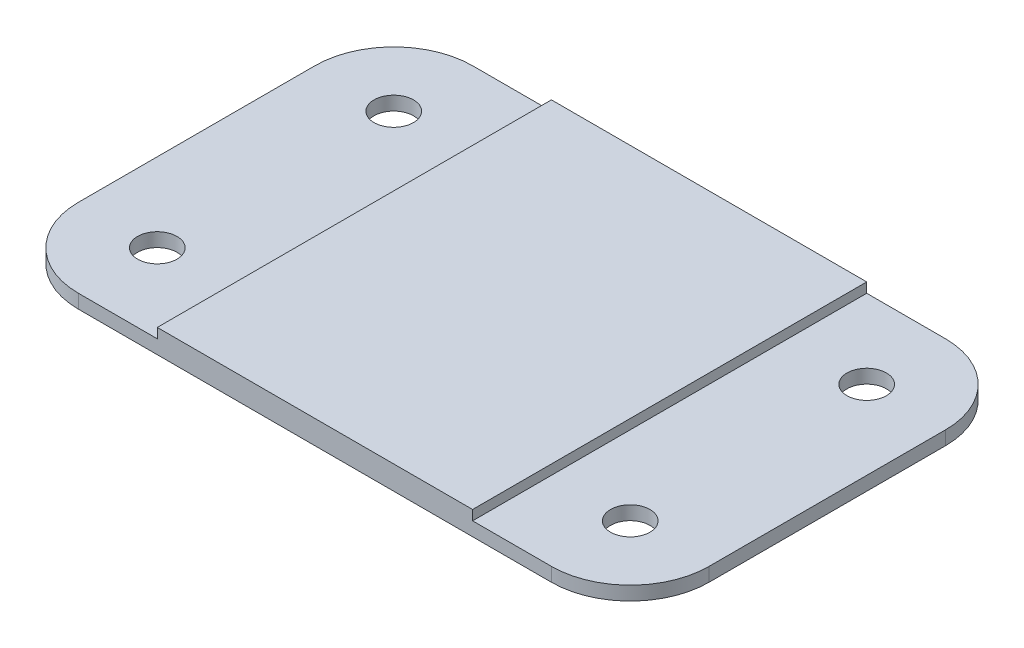
ISO-10303-21;
HEADER;
FILE_DESCRIPTION(('STEP AP214'),'2;1');
FILE_NAME('part.step','',(''),(''),'','','');
FILE_SCHEMA(('AUTOMOTIVE_DESIGN { 1 0 10303 214 1 1 1 1 }'));
ENDSEC;
DATA;
#1=APPLICATION_CONTEXT('core data for automotive mechanical design processes');
#2=APPLICATION_PROTOCOL_DEFINITION('international standard','automotive_design',2000,#1);
#3=PRODUCT_CONTEXT('',#1,'mechanical');
#4=PRODUCT('Part','Part','',(#3));
#5=PRODUCT_RELATED_PRODUCT_CATEGORY('part','',(#4));
#6=PRODUCT_DEFINITION_FORMATION('','',#4);
#7=PRODUCT_DEFINITION_CONTEXT('part definition',#1,'design');
#8=PRODUCT_DEFINITION('design','',#6,#7);
#9=PRODUCT_DEFINITION_SHAPE('','',#8);
#10=(LENGTH_UNIT() NAMED_UNIT(*) SI_UNIT(.MILLI.,.METRE.));
#11=(NAMED_UNIT(*) PLANE_ANGLE_UNIT() SI_UNIT($,.RADIAN.));
#12=(NAMED_UNIT(*) SI_UNIT($,.STERADIAN.) SOLID_ANGLE_UNIT());
#13=UNCERTAINTY_MEASURE_WITH_UNIT(LENGTH_MEASURE(1.E-05),#10,'distance_accuracy_value','');
#14=(GEOMETRIC_REPRESENTATION_CONTEXT(3) GLOBAL_UNCERTAINTY_ASSIGNED_CONTEXT((#13)) GLOBAL_UNIT_ASSIGNED_CONTEXT((#10,
#11,#12)) REPRESENTATION_CONTEXT('',''));
#15=CARTESIAN_POINT('',(0.,0.,0.));
#16=DIRECTION('',(0.,0.,1.));
#17=DIRECTION('',(1.,0.,0.));
#18=AXIS2_PLACEMENT_3D('',#15,#16,#17);
#19=CARTESIAN_POINT('',(76.2,0.,38.1));
#20=DIRECTION('',(0.,1.,0.));
#21=DIRECTION('',(0.,0.,1.));
#22=AXIS2_PLACEMENT_3D('',#19,#20,#21);
#23=PLANE('',#22);
#24=CARTESIAN_POINT('',(76.2,0.,-38.1));
#25=DIRECTION('',(0.,1.,0.));
#26=DIRECTION('',(0.,0.,1.));
#27=AXIS2_PLACEMENT_3D('',#24,#25,#26);
#28=CIRCLE('',#27,6.35);
#29=CARTESIAN_POINT('',(76.2,0.,-44.45));
#30=VERTEX_POINT('',#29);
#31=EDGE_CURVE('E348',#30,#30,#28,.T.);
#32=ORIENTED_EDGE('',*,*,#31,.T.);
#33=EDGE_LOOP('',(#32));
#34=FACE_BOUND('',#33,.T.);
#35=CARTESIAN_POINT('',(76.2,0.,38.1));
#36=DIRECTION('',(0.,1.,0.));
#37=DIRECTION('',(0.,0.,1.));
#38=AXIS2_PLACEMENT_3D('',#35,#36,#37);
#39=CIRCLE('',#38,6.35);
#40=CARTESIAN_POINT('',(76.2,0.,31.75));
#41=VERTEX_POINT('',#40);
#42=EDGE_CURVE('E391',#41,#41,#39,.T.);
#43=ORIENTED_EDGE('',*,*,#42,.T.);
#44=EDGE_LOOP('',(#43));
#45=FACE_BOUND('',#44,.T.);
#46=CARTESIAN_POINT('',(-76.2,0.,38.1));
#47=DIRECTION('',(0.,1.,0.));
#48=DIRECTION('',(0.,0.,1.));
#49=AXIS2_PLACEMENT_3D('',#46,#47,#48);
#50=CIRCLE('',#49,6.35);
#51=CARTESIAN_POINT('',(-76.2,0.,31.75));
#52=VERTEX_POINT('',#51);
#53=EDGE_CURVE('E395',#52,#52,#50,.T.);
#54=ORIENTED_EDGE('',*,*,#53,.T.);
#55=EDGE_LOOP('',(#54));
#56=FACE_BOUND('',#55,.T.);
#57=CARTESIAN_POINT('',(-76.2,0.,-38.1));
#58=DIRECTION('',(0.,1.,0.));
#59=DIRECTION('',(0.,0.,1.));
#60=AXIS2_PLACEMENT_3D('',#57,#58,#59);
#61=CIRCLE('',#60,6.35);
#62=CARTESIAN_POINT('',(-76.2,0.,-44.45));
#63=VERTEX_POINT('',#62);
#64=EDGE_CURVE('E399',#63,#63,#61,.T.);
#65=ORIENTED_EDGE('',*,*,#64,.T.);
#66=EDGE_LOOP('',(#65));
#67=FACE_BOUND('',#66,.T.);
#68=DIRECTION('',(0.,0.,1.));
#69=VECTOR('',#68,1.);
#70=CARTESIAN_POINT('',(101.6,0.,-38.0999999999998));
#71=LINE('',#70,#69);
#72=CARTESIAN_POINT('',(101.6,0.,-38.0999999999998));
#73=VERTEX_POINT('',#72);
#74=CARTESIAN_POINT('',(101.6,0.,38.0999999999998));
#75=VERTEX_POINT('',#74);
#76=EDGE_CURVE('E403',#73,#75,#71,.T.);
#77=ORIENTED_EDGE('',*,*,#76,.T.);
#78=CARTESIAN_POINT('',(76.2,0.,38.1));
#79=DIRECTION('',(0.,1.,0.));
#80=DIRECTION('',(0.,0.,1.));
#81=AXIS2_PLACEMENT_3D('',#78,#79,#80);
#82=CIRCLE('',#81,25.4);
#83=CARTESIAN_POINT('',(76.1999999999998,0.,63.5));
#84=VERTEX_POINT('',#83);
#85=EDGE_CURVE('E416',#84,#75,#82,.T.);
#86=ORIENTED_EDGE('',*,*,#85,.F.);
#87=DIRECTION('',(1.,0.,0.));
#88=VECTOR('',#87,1.);
#89=CARTESIAN_POINT('',(-76.1999999999998,0.,63.5));
#90=LINE('',#89,#88);
#91=CARTESIAN_POINT('',(-76.1999999999998,0.,63.5));
#92=VERTEX_POINT('',#91);
#93=EDGE_CURVE('E420',#92,#84,#90,.T.);
#94=ORIENTED_EDGE('',*,*,#93,.F.);
#95=CARTESIAN_POINT('',(-76.2,0.,38.1));
#96=DIRECTION('',(0.,1.,0.));
#97=DIRECTION('',(0.,0.,1.));
#98=AXIS2_PLACEMENT_3D('',#95,#96,#97);
#99=CIRCLE('',#98,25.4);
#100=CARTESIAN_POINT('',(-101.6,0.,38.0999999999998));
#101=VERTEX_POINT('',#100);
#102=EDGE_CURVE('E424',#101,#92,#99,.T.);
#103=ORIENTED_EDGE('',*,*,#102,.F.);
#104=DIRECTION('',(0.,0.,1.));
#105=VECTOR('',#104,1.);
#106=CARTESIAN_POINT('',(-101.6,0.,-38.0999999999998));
#107=LINE('',#106,#105);
#108=CARTESIAN_POINT('',(-101.6,0.,-38.0999999999998));
#109=VERTEX_POINT('',#108);
#110=EDGE_CURVE('E428',#109,#101,#107,.T.);
#111=ORIENTED_EDGE('',*,*,#110,.F.);
#112=CARTESIAN_POINT('',(-76.2,0.,-38.1));
#113=DIRECTION('',(0.,1.,0.));
#114=DIRECTION('',(0.,0.,1.));
#115=AXIS2_PLACEMENT_3D('',#112,#113,#114);
#116=CIRCLE('',#115,25.4);
#117=CARTESIAN_POINT('',(-76.1999999999998,0.,-63.5));
#118=VERTEX_POINT('',#117);
#119=EDGE_CURVE('E432',#118,#109,#116,.T.);
#120=ORIENTED_EDGE('',*,*,#119,.F.);
#121=DIRECTION('',(1.,0.,0.));
#122=VECTOR('',#121,1.);
#123=CARTESIAN_POINT('',(-76.1999999999998,0.,-63.5));
#124=LINE('',#123,#122);
#125=CARTESIAN_POINT('',(76.1999999999998,0.,-63.5));
#126=VERTEX_POINT('',#125);
#127=EDGE_CURVE('E436',#118,#126,#124,.T.);
#128=ORIENTED_EDGE('',*,*,#127,.T.);
#129=CARTESIAN_POINT('',(76.2,0.,-38.1));
#130=DIRECTION('',(0.,-1.,0.));
#131=DIRECTION('',(0.,0.,-1.));
#132=AXIS2_PLACEMENT_3D('',#129,#130,#131);
#133=CIRCLE('',#132,25.4);
#134=EDGE_CURVE('E409',#126,#73,#133,.T.);
#135=ORIENTED_EDGE('',*,*,#134,.T.);
#136=EDGE_LOOP('',(#77,#86,#94,#103,#111,#120,#128,#135));
#137=FACE_BOUND('',#136,.T.);
#138=DIRECTION('',(1.,0.,0.));
#139=VECTOR('',#138,1.);
#140=CARTESIAN_POINT('',(-12.7,0.,-12.7));
#141=LINE('',#140,#139);
#142=CARTESIAN_POINT('',(-12.7,0.,-12.7));
#143=VERTEX_POINT('',#142);
#144=CARTESIAN_POINT('',(12.7,0.,-12.7));
#145=VERTEX_POINT('',#144);
#146=EDGE_CURVE('E279',#143,#145,#141,.T.);
#147=ORIENTED_EDGE('',*,*,#146,.F.);
#148=DIRECTION('',(0.,0.,-1.));
#149=VECTOR('',#148,1.);
#150=CARTESIAN_POINT('',(-12.7,0.,12.7));
#151=LINE('',#150,#149);
#152=CARTESIAN_POINT('',(-12.7,0.,12.7));
#153=VERTEX_POINT('',#152);
#154=EDGE_CURVE('E274',#153,#143,#151,.T.);
#155=ORIENTED_EDGE('',*,*,#154,.F.);
#156=DIRECTION('',(1.,0.,0.));
#157=VECTOR('',#156,1.);
#158=CARTESIAN_POINT('',(-12.7,0.,12.7));
#159=LINE('',#158,#157);
#160=CARTESIAN_POINT('',(12.7,0.,12.7));
#161=VERTEX_POINT('',#160);
#162=EDGE_CURVE('E170',#153,#161,#159,.T.);
#163=ORIENTED_EDGE('',*,*,#162,.T.);
#164=DIRECTION('',(0.,0.,-1.));
#165=VECTOR('',#164,1.);
#166=CARTESIAN_POINT('',(12.7,0.,12.7));
#167=LINE('',#166,#165);
#168=EDGE_CURVE('E165',#161,#145,#167,.T.);
#169=ORIENTED_EDGE('',*,*,#168,.T.);
#170=EDGE_LOOP('',(#147,#155,#163,#169));
#171=FACE_BOUND('',#170,.T.);
#172=ADVANCED_FACE('F147',(#34,#45,#56,#67,#137,#171),#23,.F.);
#173=CARTESIAN_POINT('',(76.2,7.62,38.1));
#174=DIRECTION('',(0.,1.,0.));
#175=DIRECTION('',(0.,0.,1.));
#176=AXIS2_PLACEMENT_3D('',#173,#174,#175);
#177=PLANE('',#176);
#178=DIRECTION('',(1.,0.,0.));
#179=VECTOR('',#178,1.);
#180=CARTESIAN_POINT('',(-76.1999999999998,7.62,-63.5));
#181=LINE('',#180,#179);
#182=CARTESIAN_POINT('',(-50.8,7.62,-63.5));
#183=VERTEX_POINT('',#182);
#184=CARTESIAN_POINT('',(50.8,7.62,-63.5));
#185=VERTEX_POINT('',#184);
#186=EDGE_CURVE('E408',#183,#185,#181,.T.);
#187=ORIENTED_EDGE('',*,*,#186,.F.);
#188=DIRECTION('',(0.,0.,1.));
#189=VECTOR('',#188,1.);
#190=CARTESIAN_POINT('',(-50.8,7.62,0.));
#191=LINE('',#190,#189);
#192=CARTESIAN_POINT('',(-50.8,7.62,63.5));
#193=VERTEX_POINT('',#192);
#194=EDGE_CURVE('E316',#183,#193,#191,.T.);
#195=ORIENTED_EDGE('',*,*,#194,.T.);
#196=DIRECTION('',(1.,0.,0.));
#197=VECTOR('',#196,1.);
#198=CARTESIAN_POINT('',(-76.1999999999998,7.62,63.5));
#199=LINE('',#198,#197);
#200=CARTESIAN_POINT('',(50.8,7.62,63.5));
#201=VERTEX_POINT('',#200);
#202=EDGE_CURVE('E404',#193,#201,#199,.T.);
#203=ORIENTED_EDGE('',*,*,#202,.T.);
#204=DIRECTION('',(0.,0.,1.));
#205=VECTOR('',#204,1.);
#206=CARTESIAN_POINT('',(50.8,7.62,0.));
#207=LINE('',#206,#205);
#208=EDGE_CURVE('E282',#185,#201,#207,.T.);
#209=ORIENTED_EDGE('',*,*,#208,.F.);
#210=EDGE_LOOP('',(#187,#195,#203,#209));
#211=FACE_BOUND('',#210,.T.);
#212=ADVANCED_FACE('F490',(#211),#177,.T.);
#213=CARTESIAN_POINT('',(101.6,7.62,-38.0999999999998));
#214=DIRECTION('',(1.,0.,0.));
#215=DIRECTION('',(0.,0.,-1.));
#216=AXIS2_PLACEMENT_3D('',#213,#214,#215);
#217=PLANE('',#216);
#218=DIRECTION('',(0.,-1.,0.));
#219=VECTOR('',#218,1.);
#220=CARTESIAN_POINT('',(101.6,7.62,-38.0999999999998));
#221=LINE('',#220,#219);
#222=CARTESIAN_POINT('',(101.6,4.445,-38.0999999999998));
#223=VERTEX_POINT('',#222);
#224=EDGE_CURVE('E12',#223,#73,#221,.T.);
#225=ORIENTED_EDGE('',*,*,#224,.F.);
#226=DIRECTION('',(0.,0.,-1.));
#227=VECTOR('',#226,1.);
#228=CARTESIAN_POINT('',(101.6,4.445,0.));
#229=LINE('',#228,#227);
#230=CARTESIAN_POINT('',(101.6,4.445,38.0999999999998));
#231=VERTEX_POINT('',#230);
#232=EDGE_CURVE('E374',#231,#223,#229,.T.);
#233=ORIENTED_EDGE('',*,*,#232,.F.);
#234=DIRECTION('',(0.,-1.,0.));
#235=VECTOR('',#234,1.);
#236=CARTESIAN_POINT('',(101.6,7.62,38.0999999999998));
#237=LINE('',#236,#235);
#238=EDGE_CURVE('E151',#231,#75,#237,.T.);
#239=ORIENTED_EDGE('',*,*,#238,.T.);
#240=ORIENTED_EDGE('',*,*,#76,.F.);
#241=EDGE_LOOP('',(#225,#233,#239,#240));
#242=FACE_BOUND('',#241,.T.);
#243=ADVANCED_FACE('F149',(#242),#217,.T.);
#244=CARTESIAN_POINT('',(76.2,7.62,-38.1));
#245=DIRECTION('',(0.,-1.,0.));
#246=DIRECTION('',(0.,0.,-1.));
#247=AXIS2_PLACEMENT_3D('',#244,#245,#246);
#248=CYLINDRICAL_SURFACE('',#247,25.4);
#249=DIRECTION('',(0.,-1.,0.));
#250=VECTOR('',#249,1.);
#251=CARTESIAN_POINT('',(76.1999999999998,7.62,-63.5));
#252=LINE('',#251,#250);
#253=CARTESIAN_POINT('',(76.1999999999998,4.445,-63.5));
#254=VERTEX_POINT('',#253);
#255=EDGE_CURVE('E157',#254,#126,#252,.T.);
#256=ORIENTED_EDGE('',*,*,#255,.F.);
#257=CARTESIAN_POINT('',(76.2,4.445,-38.1));
#258=DIRECTION('',(0.,1.,0.));
#259=DIRECTION('',(0.,0.,1.));
#260=AXIS2_PLACEMENT_3D('',#257,#258,#259);
#261=CIRCLE('',#260,25.4);
#262=EDGE_CURVE('E377',#223,#254,#261,.T.);
#263=ORIENTED_EDGE('',*,*,#262,.F.);
#264=ORIENTED_EDGE('',*,*,#224,.T.);
#265=ORIENTED_EDGE('',*,*,#134,.F.);
#266=EDGE_LOOP('',(#256,#263,#264,#265));
#267=FACE_BOUND('',#266,.T.);
#268=ADVANCED_FACE('F476',(#267),#248,.T.);
#269=CARTESIAN_POINT('',(-76.1999999999998,7.62,-63.5));
#270=DIRECTION('',(0.,0.,-1.));
#271=DIRECTION('',(-1.,0.,0.));
#272=AXIS2_PLACEMENT_3D('',#269,#270,#271);
#273=PLANE('',#272);
#274=DIRECTION('',(-1.,0.,0.));
#275=VECTOR('',#274,1.);
#276=CARTESIAN_POINT('',(0.,4.445,-63.5));
#277=LINE('',#276,#275);
#278=CARTESIAN_POINT('',(-50.8,4.445,-63.5));
#279=VERTEX_POINT('',#278);
#280=CARTESIAN_POINT('',(-76.1999999999998,4.445,-63.5));
#281=VERTEX_POINT('',#280);
#282=EDGE_CURVE('E315',#279,#281,#277,.T.);
#283=ORIENTED_EDGE('',*,*,#282,.F.);
#284=DIRECTION('',(0.,1.,0.));
#285=VECTOR('',#284,1.);
#286=CARTESIAN_POINT('',(-50.8,4.445,-63.5));
#287=LINE('',#286,#285);
#288=EDGE_CURVE('E340',#279,#183,#287,.T.);
#289=ORIENTED_EDGE('',*,*,#288,.T.);
#290=ORIENTED_EDGE('',*,*,#186,.T.);
#291=DIRECTION('',(0.,1.,0.));
#292=VECTOR('',#291,1.);
#293=CARTESIAN_POINT('',(50.8,4.445,-63.5));
#294=LINE('',#293,#292);
#295=CARTESIAN_POINT('',(50.8,4.445,-63.5));
#296=VERTEX_POINT('',#295);
#297=EDGE_CURVE('E380',#296,#185,#294,.T.);
#298=ORIENTED_EDGE('',*,*,#297,.F.);
#299=DIRECTION('',(-1.,0.,0.));
#300=VECTOR('',#299,1.);
#301=CARTESIAN_POINT('',(0.,4.445,-63.5));
#302=LINE('',#301,#300);
#303=EDGE_CURVE('E360',#254,#296,#302,.T.);
#304=ORIENTED_EDGE('',*,*,#303,.F.);
#305=ORIENTED_EDGE('',*,*,#255,.T.);
#306=ORIENTED_EDGE('',*,*,#127,.F.);
#307=DIRECTION('',(0.,-1.,0.));
#308=VECTOR('',#307,1.);
#309=CARTESIAN_POINT('',(-76.1999999999998,7.62,-63.5));
#310=LINE('',#309,#308);
#311=EDGE_CURVE('E445',#281,#118,#310,.T.);
#312=ORIENTED_EDGE('',*,*,#311,.F.);
#313=EDGE_LOOP('',(#283,#289,#290,#298,#304,#305,#306,#312));
#314=FACE_BOUND('',#313,.T.);
#315=ADVANCED_FACE('F484',(#314),#273,.T.);
#316=CARTESIAN_POINT('',(-76.2,7.62,-38.1));
#317=DIRECTION('',(0.,-1.,0.));
#318=DIRECTION('',(0.,0.,-1.));
#319=AXIS2_PLACEMENT_3D('',#316,#317,#318);
#320=CYLINDRICAL_SURFACE('',#319,25.4);
#321=CARTESIAN_POINT('',(-76.2,4.445,-38.1));
#322=DIRECTION('',(0.,1.,0.));
#323=DIRECTION('',(0.,0.,1.));
#324=AXIS2_PLACEMENT_3D('',#321,#322,#323);
#325=CIRCLE('',#324,25.4);
#326=CARTESIAN_POINT('',(-101.6,4.445,-38.0999999999998));
#327=VERTEX_POINT('',#326);
#328=EDGE_CURVE('E319',#281,#327,#325,.T.);
#329=ORIENTED_EDGE('',*,*,#328,.F.);
#330=ORIENTED_EDGE('',*,*,#311,.T.);
#331=ORIENTED_EDGE('',*,*,#119,.T.);
#332=DIRECTION('',(0.,-1.,0.));
#333=VECTOR('',#332,1.);
#334=CARTESIAN_POINT('',(-101.6,7.62,-38.0999999999998));
#335=LINE('',#334,#333);
#336=EDGE_CURVE('E448',#327,#109,#335,.T.);
#337=ORIENTED_EDGE('',*,*,#336,.F.);
#338=EDGE_LOOP('',(#329,#330,#331,#337));
#339=FACE_BOUND('',#338,.T.);
#340=ADVANCED_FACE('F510',(#339),#320,.T.);
#341=CARTESIAN_POINT('',(-101.6,7.62,-38.0999999999998));
#342=DIRECTION('',(1.,0.,0.));
#343=DIRECTION('',(0.,0.,-1.));
#344=AXIS2_PLACEMENT_3D('',#341,#342,#343);
#345=PLANE('',#344);
#346=DIRECTION('',(0.,0.,1.));
#347=VECTOR('',#346,1.);
#348=CARTESIAN_POINT('',(-101.6,4.445,0.));
#349=LINE('',#348,#347);
#350=CARTESIAN_POINT('',(-101.6,4.445,38.0999999999998));
#351=VERTEX_POINT('',#350);
#352=EDGE_CURVE('E322',#327,#351,#349,.T.);
#353=ORIENTED_EDGE('',*,*,#352,.F.);
#354=ORIENTED_EDGE('',*,*,#336,.T.);
#355=ORIENTED_EDGE('',*,*,#110,.T.);
#356=DIRECTION('',(0.,-1.,0.));
#357=VECTOR('',#356,1.);
#358=CARTESIAN_POINT('',(-101.6,7.62,38.0999999999998));
#359=LINE('',#358,#357);
#360=EDGE_CURVE('E451',#351,#101,#359,.T.);
#361=ORIENTED_EDGE('',*,*,#360,.F.);
#362=EDGE_LOOP('',(#353,#354,#355,#361));
#363=FACE_BOUND('',#362,.T.);
#364=ADVANCED_FACE('F506',(#363),#345,.F.);
#365=CARTESIAN_POINT('',(-76.2,7.62,38.1));
#366=DIRECTION('',(0.,-1.,0.));
#367=DIRECTION('',(0.,0.,-1.));
#368=AXIS2_PLACEMENT_3D('',#365,#366,#367);
#369=CYLINDRICAL_SURFACE('',#368,25.4);
#370=CARTESIAN_POINT('',(-76.2,4.445,38.1));
#371=DIRECTION('',(0.,1.,0.));
#372=DIRECTION('',(0.,0.,1.));
#373=AXIS2_PLACEMENT_3D('',#370,#371,#372);
#374=CIRCLE('',#373,25.4);
#375=CARTESIAN_POINT('',(-76.1999999999998,4.445,63.5));
#376=VERTEX_POINT('',#375);
#377=EDGE_CURVE('E325',#351,#376,#374,.T.);
#378=ORIENTED_EDGE('',*,*,#377,.F.);
#379=ORIENTED_EDGE('',*,*,#360,.T.);
#380=ORIENTED_EDGE('',*,*,#102,.T.);
#381=DIRECTION('',(0.,-1.,0.));
#382=VECTOR('',#381,1.);
#383=CARTESIAN_POINT('',(-76.1999999999998,7.62,63.5));
#384=LINE('',#383,#382);
#385=EDGE_CURVE('E454',#376,#92,#384,.T.);
#386=ORIENTED_EDGE('',*,*,#385,.F.);
#387=EDGE_LOOP('',(#378,#379,#380,#386));
#388=FACE_BOUND('',#387,.T.);
#389=ADVANCED_FACE('F502',(#388),#369,.T.);
#390=CARTESIAN_POINT('',(-76.1999999999998,7.62,63.5));
#391=DIRECTION('',(0.,0.,-1.));
#392=DIRECTION('',(-1.,0.,0.));
#393=AXIS2_PLACEMENT_3D('',#390,#391,#392);
#394=PLANE('',#393);
#395=DIRECTION('',(0.,1.,0.));
#396=VECTOR('',#395,1.);
#397=CARTESIAN_POINT('',(-50.8,4.445,63.5));
#398=LINE('',#397,#396);
#399=CARTESIAN_POINT('',(-50.8,4.445,63.5));
#400=VERTEX_POINT('',#399);
#401=EDGE_CURVE('E345',#400,#193,#398,.T.);
#402=ORIENTED_EDGE('',*,*,#401,.F.);
#403=DIRECTION('',(1.,0.,0.));
#404=VECTOR('',#403,1.);
#405=CARTESIAN_POINT('',(0.,4.445,63.5));
#406=LINE('',#405,#404);
#407=EDGE_CURVE('E328',#376,#400,#406,.T.);
#408=ORIENTED_EDGE('',*,*,#407,.F.);
#409=ORIENTED_EDGE('',*,*,#385,.T.);
#410=ORIENTED_EDGE('',*,*,#93,.T.);
#411=DIRECTION('',(0.,-1.,0.));
#412=VECTOR('',#411,1.);
#413=CARTESIAN_POINT('',(76.1999999999998,7.62,63.5));
#414=LINE('',#413,#412);
#415=CARTESIAN_POINT('',(76.1999999999998,4.445,63.5));
#416=VERTEX_POINT('',#415);
#417=EDGE_CURVE('E456',#416,#84,#414,.T.);
#418=ORIENTED_EDGE('',*,*,#417,.F.);
#419=DIRECTION('',(1.,0.,0.));
#420=VECTOR('',#419,1.);
#421=CARTESIAN_POINT('',(0.,4.445,63.5));
#422=LINE('',#421,#420);
#423=CARTESIAN_POINT('',(50.8,4.445,63.5));
#424=VERTEX_POINT('',#423);
#425=EDGE_CURVE('E368',#424,#416,#422,.T.);
#426=ORIENTED_EDGE('',*,*,#425,.F.);
#427=DIRECTION('',(0.,1.,0.));
#428=VECTOR('',#427,1.);
#429=CARTESIAN_POINT('',(50.8,4.445,63.5));
#430=LINE('',#429,#428);
#431=EDGE_CURVE('E344',#424,#201,#430,.T.);
#432=ORIENTED_EDGE('',*,*,#431,.T.);
#433=ORIENTED_EDGE('',*,*,#202,.F.);
#434=EDGE_LOOP('',(#402,#408,#409,#410,#418,#426,#432,#433));
#435=FACE_BOUND('',#434,.T.);
#436=ADVANCED_FACE('F494',(#435),#394,.F.);
#437=CARTESIAN_POINT('',(76.2,7.62,38.1));
#438=DIRECTION('',(0.,-1.,0.));
#439=DIRECTION('',(0.,0.,-1.));
#440=AXIS2_PLACEMENT_3D('',#437,#438,#439);
#441=CYLINDRICAL_SURFACE('',#440,25.4);
#442=CARTESIAN_POINT('',(76.2,4.445,38.1));
#443=DIRECTION('',(0.,1.,0.));
#444=DIRECTION('',(0.,0.,1.));
#445=AXIS2_PLACEMENT_3D('',#442,#443,#444);
#446=CIRCLE('',#445,25.4);
#447=EDGE_CURVE('E371',#416,#231,#446,.T.);
#448=ORIENTED_EDGE('',*,*,#447,.F.);
#449=ORIENTED_EDGE('',*,*,#417,.T.);
#450=ORIENTED_EDGE('',*,*,#85,.T.);
#451=ORIENTED_EDGE('',*,*,#238,.F.);
#452=EDGE_LOOP('',(#448,#449,#450,#451));
#453=FACE_BOUND('',#452,.T.);
#454=ADVANCED_FACE('F468',(#453),#441,.T.);
#455=CARTESIAN_POINT('',(-76.2,7.62,-38.1));
#456=DIRECTION('',(0.,-1.,0.));
#457=DIRECTION('',(0.,0.,-1.));
#458=AXIS2_PLACEMENT_3D('',#455,#456,#457);
#459=CYLINDRICAL_SURFACE('',#458,6.35);
#460=CARTESIAN_POINT('',(-76.2,4.445,-38.1));
#461=DIRECTION('',(0.,1.,0.));
#462=DIRECTION('',(0.,0.,1.));
#463=AXIS2_PLACEMENT_3D('',#460,#461,#462);
#464=CIRCLE('',#463,6.35);
#465=CARTESIAN_POINT('',(-76.2,4.445,-44.45));
#466=VERTEX_POINT('',#465);
#467=EDGE_CURVE('E332',#466,#466,#464,.F.);
#468=CARTESIAN_POINT('',(-76.2,0.,-44.45));
#469=CARTESIAN_POINT('',(-76.2,0.0463020833333334,-44.45));
#470=CARTESIAN_POINT('',(-76.2,0.0926041666666668,-44.45));
#471=CARTESIAN_POINT('',(-76.2,0.185208333333334,-44.45));
#472=CARTESIAN_POINT('',(-76.2,0.231510416666667,-44.45));
#473=CARTESIAN_POINT('',(-76.2,0.324114583333333,-44.45));
#474=CARTESIAN_POINT('',(-76.2,0.370416666666666,-44.45));
#475=CARTESIAN_POINT('',(-76.2,0.463020833333333,-44.45));
#476=CARTESIAN_POINT('',(-76.2,0.509322916666666,-44.45));
#477=CARTESIAN_POINT('',(-76.2,0.601927083333333,-44.45));
#478=CARTESIAN_POINT('',(-76.2,0.648229166666666,-44.45));
#479=CARTESIAN_POINT('',(-76.2,0.740833333333333,-44.45));
#480=CARTESIAN_POINT('',(-76.2,0.787135416666667,-44.45));
#481=CARTESIAN_POINT('',(-76.2,0.879739583333333,-44.45));
#482=CARTESIAN_POINT('',(-76.2,0.926041666666667,-44.45));
#483=CARTESIAN_POINT('',(-76.2,1.01864583333333,-44.45));
#484=CARTESIAN_POINT('',(-76.2,1.06494791666667,-44.45));
#485=CARTESIAN_POINT('',(-76.2,1.15755208333333,-44.45));
#486=CARTESIAN_POINT('',(-76.2,1.20385416666667,-44.45));
#487=CARTESIAN_POINT('',(-76.2,1.29645833333333,-44.45));
#488=CARTESIAN_POINT('',(-76.2,1.34276041666667,-44.45));
#489=CARTESIAN_POINT('',(-76.2,1.43536458333333,-44.45));
#490=CARTESIAN_POINT('',(-76.2,1.48166666666667,-44.45));
#491=CARTESIAN_POINT('',(-76.2,1.57427083333333,-44.45));
#492=CARTESIAN_POINT('',(-76.2,1.62057291666667,-44.45));
#493=CARTESIAN_POINT('',(-76.2,1.71317708333333,-44.45));
#494=CARTESIAN_POINT('',(-76.2,1.75947916666667,-44.45));
#495=CARTESIAN_POINT('',(-76.2,1.85208333333333,-44.45));
#496=CARTESIAN_POINT('',(-76.2,1.89838541666667,-44.45));
#497=CARTESIAN_POINT('',(-76.2,1.99098958333333,-44.45));
#498=CARTESIAN_POINT('',(-76.2,2.03729166666667,-44.45));
#499=CARTESIAN_POINT('',(-76.2,2.12989583333333,-44.45));
#500=CARTESIAN_POINT('',(-76.2,2.17619791666667,-44.45));
#501=CARTESIAN_POINT('',(-76.2,2.26880208333333,-44.45));
#502=CARTESIAN_POINT('',(-76.2,2.31510416666667,-44.45));
#503=CARTESIAN_POINT('',(-76.2,2.40770833333333,-44.45));
#504=CARTESIAN_POINT('',(-76.2,2.45401041666667,-44.45));
#505=CARTESIAN_POINT('',(-76.2,2.54661458333333,-44.45));
#506=CARTESIAN_POINT('',(-76.2,2.59291666666667,-44.45));
#507=CARTESIAN_POINT('',(-76.2,2.68552083333333,-44.45));
#508=CARTESIAN_POINT('',(-76.2,2.73182291666667,-44.45));
#509=CARTESIAN_POINT('',(-76.2,2.82442708333333,-44.45));
#510=CARTESIAN_POINT('',(-76.2,2.87072916666667,-44.45));
#511=CARTESIAN_POINT('',(-76.2,2.96333333333333,-44.45));
#512=CARTESIAN_POINT('',(-76.2,3.00963541666667,-44.45));
#513=CARTESIAN_POINT('',(-76.2,3.10223958333333,-44.45));
#514=CARTESIAN_POINT('',(-76.2,3.14854166666667,-44.45));
#515=CARTESIAN_POINT('',(-76.2,3.24114583333333,-44.45));
#516=CARTESIAN_POINT('',(-76.2,3.28744791666667,-44.45));
#517=CARTESIAN_POINT('',(-76.2,3.38005208333333,-44.45));
#518=CARTESIAN_POINT('',(-76.2,3.42635416666667,-44.45));
#519=CARTESIAN_POINT('',(-76.2,3.51895833333333,-44.45));
#520=CARTESIAN_POINT('',(-76.2,3.56526041666667,-44.45));
#521=CARTESIAN_POINT('',(-76.2,3.65786458333333,-44.45));
#522=CARTESIAN_POINT('',(-76.2,3.70416666666667,-44.45));
#523=CARTESIAN_POINT('',(-76.2,3.79677083333333,-44.45));
#524=CARTESIAN_POINT('',(-76.2,3.84307291666667,-44.45));
#525=CARTESIAN_POINT('',(-76.2,3.93567708333333,-44.45));
#526=CARTESIAN_POINT('',(-76.2,3.98197916666667,-44.45));
#527=CARTESIAN_POINT('',(-76.2,4.07458333333333,-44.45));
#528=CARTESIAN_POINT('',(-76.2,4.12088541666667,-44.45));
#529=CARTESIAN_POINT('',(-76.2,4.21348958333333,-44.45));
#530=CARTESIAN_POINT('',(-76.2,4.25979166666666,-44.45));
#531=CARTESIAN_POINT('',(-76.2,4.35239583333333,-44.45));
#532=CARTESIAN_POINT('',(-76.2,4.39869791666667,-44.45));
#533=CARTESIAN_POINT('',(-76.2,4.445,-44.45));
#534=B_SPLINE_CURVE_WITH_KNOTS('',3,(#468,#469,#470,#471,#472,#473,#474,#475,#476,#477,#478,
#479,#480,#481,#482,#483,#484,#485,#486,#487,#488,#489,#490,#491,#492,#493,#494,#495,#496,#497,
#498,#499,#500,#501,#502,#503,#504,#505,#506,#507,#508,#509,#510,#511,#512,#513,#514,#515,#516,
#517,#518,#519,#520,#521,#522,#523,#524,#525,#526,#527,#528,#529,#530,#531,#532,#533),
.UNSPECIFIED.,.F.,.F.,(4,2,2,2,2,2,2,2,2,2,2,2,2,2,2,2,2,2,2,2,2,2,2,2,2,2,2,2,2,2,2,2,4),(0.,
0.13890625,0.2778125,0.41671875,0.555625,0.69453125,0.8334375,0.97234375,1.11125,1.25015625,
1.3890625,1.52796875,1.666875,1.80578125,1.9446875,2.08359375,2.2225,2.36140625,2.5003125,
2.63921875,2.778125,2.91703125,3.0559375,3.19484375,3.33375,3.47265625,3.6115625,3.75046875,
3.889375,4.02828125,4.1671875,4.30609375,4.445),.UNSPECIFIED.);
#535=EDGE_CURVE('BSEAM551',#63,#466,#534,.T.);
#536=ORIENTED_EDGE('',*,*,#64,.F.);
#537=ORIENTED_EDGE('',*,*,#467,.F.);
#538=ORIENTED_EDGE('',*,*,#535,.T.);
#539=ORIENTED_EDGE('',*,*,#535,.F.);
#540=EDGE_LOOP('',(#536,#538,#537,#539));
#541=FACE_BOUND('',#540,.T.);
#542=ADVANCED_FACE('F551',(#541),#459,.F.);
#543=CARTESIAN_POINT('',(-76.2,7.62,38.1));
#544=DIRECTION('',(0.,-1.,0.));
#545=DIRECTION('',(0.,0.,-1.));
#546=AXIS2_PLACEMENT_3D('',#543,#544,#545);
#547=CYLINDRICAL_SURFACE('',#546,6.35);
#548=CARTESIAN_POINT('',(-76.2,4.445,38.1));
#549=DIRECTION('',(0.,1.,0.));
#550=DIRECTION('',(0.,0.,1.));
#551=AXIS2_PLACEMENT_3D('',#548,#549,#550);
#552=CIRCLE('',#551,6.35);
#553=CARTESIAN_POINT('',(-76.2,4.445,31.75));
#554=VERTEX_POINT('',#553);
#555=EDGE_CURVE('E336',#554,#554,#552,.F.);
#556=CARTESIAN_POINT('',(-76.2,0.,31.75));
#557=CARTESIAN_POINT('',(-76.2,0.0463020833333334,31.75));
#558=CARTESIAN_POINT('',(-76.2,0.0926041666666668,31.75));
#559=CARTESIAN_POINT('',(-76.2,0.185208333333334,31.75));
#560=CARTESIAN_POINT('',(-76.2,0.231510416666667,31.75));
#561=CARTESIAN_POINT('',(-76.2,0.324114583333333,31.75));
#562=CARTESIAN_POINT('',(-76.2,0.370416666666666,31.75));
#563=CARTESIAN_POINT('',(-76.2,0.463020833333333,31.75));
#564=CARTESIAN_POINT('',(-76.2,0.509322916666666,31.75));
#565=CARTESIAN_POINT('',(-76.2,0.601927083333333,31.75));
#566=CARTESIAN_POINT('',(-76.2,0.648229166666666,31.75));
#567=CARTESIAN_POINT('',(-76.2,0.740833333333333,31.75));
#568=CARTESIAN_POINT('',(-76.2,0.787135416666667,31.75));
#569=CARTESIAN_POINT('',(-76.2,0.879739583333333,31.75));
#570=CARTESIAN_POINT('',(-76.2,0.926041666666667,31.75));
#571=CARTESIAN_POINT('',(-76.2,1.01864583333333,31.75));
#572=CARTESIAN_POINT('',(-76.2,1.06494791666667,31.75));
#573=CARTESIAN_POINT('',(-76.2,1.15755208333333,31.75));
#574=CARTESIAN_POINT('',(-76.2,1.20385416666667,31.75));
#575=CARTESIAN_POINT('',(-76.2,1.29645833333333,31.75));
#576=CARTESIAN_POINT('',(-76.2,1.34276041666667,31.75));
#577=CARTESIAN_POINT('',(-76.2,1.43536458333333,31.75));
#578=CARTESIAN_POINT('',(-76.2,1.48166666666667,31.75));
#579=CARTESIAN_POINT('',(-76.2,1.57427083333333,31.75));
#580=CARTESIAN_POINT('',(-76.2,1.62057291666667,31.75));
#581=CARTESIAN_POINT('',(-76.2,1.71317708333333,31.75));
#582=CARTESIAN_POINT('',(-76.2,1.75947916666667,31.75));
#583=CARTESIAN_POINT('',(-76.2,1.85208333333333,31.75));
#584=CARTESIAN_POINT('',(-76.2,1.89838541666667,31.75));
#585=CARTESIAN_POINT('',(-76.2,1.99098958333333,31.75));
#586=CARTESIAN_POINT('',(-76.2,2.03729166666667,31.75));
#587=CARTESIAN_POINT('',(-76.2,2.12989583333333,31.75));
#588=CARTESIAN_POINT('',(-76.2,2.17619791666667,31.75));
#589=CARTESIAN_POINT('',(-76.2,2.26880208333333,31.75));
#590=CARTESIAN_POINT('',(-76.2,2.31510416666667,31.75));
#591=CARTESIAN_POINT('',(-76.2,2.40770833333333,31.75));
#592=CARTESIAN_POINT('',(-76.2,2.45401041666667,31.75));
#593=CARTESIAN_POINT('',(-76.2,2.54661458333333,31.75));
#594=CARTESIAN_POINT('',(-76.2,2.59291666666667,31.75));
#595=CARTESIAN_POINT('',(-76.2,2.68552083333333,31.75));
#596=CARTESIAN_POINT('',(-76.2,2.73182291666667,31.75));
#597=CARTESIAN_POINT('',(-76.2,2.82442708333333,31.75));
#598=CARTESIAN_POINT('',(-76.2,2.87072916666667,31.75));
#599=CARTESIAN_POINT('',(-76.2,2.96333333333333,31.75));
#600=CARTESIAN_POINT('',(-76.2,3.00963541666667,31.75));
#601=CARTESIAN_POINT('',(-76.2,3.10223958333333,31.75));
#602=CARTESIAN_POINT('',(-76.2,3.14854166666667,31.75));
#603=CARTESIAN_POINT('',(-76.2,3.24114583333333,31.75));
#604=CARTESIAN_POINT('',(-76.2,3.28744791666667,31.75));
#605=CARTESIAN_POINT('',(-76.2,3.38005208333333,31.75));
#606=CARTESIAN_POINT('',(-76.2,3.42635416666667,31.75));
#607=CARTESIAN_POINT('',(-76.2,3.51895833333333,31.75));
#608=CARTESIAN_POINT('',(-76.2,3.56526041666667,31.75));
#609=CARTESIAN_POINT('',(-76.2,3.65786458333333,31.75));
#610=CARTESIAN_POINT('',(-76.2,3.70416666666667,31.75));
#611=CARTESIAN_POINT('',(-76.2,3.79677083333333,31.75));
#612=CARTESIAN_POINT('',(-76.2,3.84307291666667,31.75));
#613=CARTESIAN_POINT('',(-76.2,3.93567708333333,31.75));
#614=CARTESIAN_POINT('',(-76.2,3.98197916666667,31.75));
#615=CARTESIAN_POINT('',(-76.2,4.07458333333333,31.75));
#616=CARTESIAN_POINT('',(-76.2,4.12088541666667,31.75));
#617=CARTESIAN_POINT('',(-76.2,4.21348958333333,31.75));
#618=CARTESIAN_POINT('',(-76.2,4.25979166666666,31.75));
#619=CARTESIAN_POINT('',(-76.2,4.35239583333333,31.75));
#620=CARTESIAN_POINT('',(-76.2,4.39869791666667,31.75));
#621=CARTESIAN_POINT('',(-76.2,4.445,31.75));
#622=B_SPLINE_CURVE_WITH_KNOTS('',3,(#556,#557,#558,#559,#560,#561,#562,#563,#564,#565,#566,
#567,#568,#569,#570,#571,#572,#573,#574,#575,#576,#577,#578,#579,#580,#581,#582,#583,#584,#585,
#586,#587,#588,#589,#590,#591,#592,#593,#594,#595,#596,#597,#598,#599,#600,#601,#602,#603,#604,
#605,#606,#607,#608,#609,#610,#611,#612,#613,#614,#615,#616,#617,#618,#619,#620,#621),
.UNSPECIFIED.,.F.,.F.,(4,2,2,2,2,2,2,2,2,2,2,2,2,2,2,2,2,2,2,2,2,2,2,2,2,2,2,2,2,2,2,2,4),(0.,
0.13890625,0.2778125,0.41671875,0.555625,0.69453125,0.8334375,0.97234375,1.11125,1.25015625,
1.3890625,1.52796875,1.666875,1.80578125,1.9446875,2.08359375,2.2225,2.36140625,2.5003125,
2.63921875,2.778125,2.91703125,3.0559375,3.19484375,3.33375,3.47265625,3.6115625,3.75046875,
3.889375,4.02828125,4.1671875,4.30609375,4.445),.UNSPECIFIED.);
#623=EDGE_CURVE('BSEAM555',#52,#554,#622,.T.);
#624=ORIENTED_EDGE('',*,*,#53,.F.);
#625=ORIENTED_EDGE('',*,*,#555,.F.);
#626=ORIENTED_EDGE('',*,*,#623,.T.);
#627=ORIENTED_EDGE('',*,*,#623,.F.);
#628=EDGE_LOOP('',(#624,#626,#625,#627));
#629=FACE_BOUND('',#628,.T.);
#630=ADVANCED_FACE('F555',(#629),#547,.F.);
#631=CARTESIAN_POINT('',(76.2,7.62,38.1));
#632=DIRECTION('',(0.,-1.,0.));
#633=DIRECTION('',(0.,0.,-1.));
#634=AXIS2_PLACEMENT_3D('',#631,#632,#633);
#635=CYLINDRICAL_SURFACE('',#634,6.35);
#636=CARTESIAN_POINT('',(76.2,4.445,38.1));
#637=DIRECTION('',(0.,1.,0.));
#638=DIRECTION('',(0.,0.,1.));
#639=AXIS2_PLACEMENT_3D('',#636,#637,#638);
#640=CIRCLE('',#639,6.35);
#641=CARTESIAN_POINT('',(76.2,4.445,31.75));
#642=VERTEX_POINT('',#641);
#643=EDGE_CURVE('E352',#642,#642,#640,.F.);
#644=CARTESIAN_POINT('',(76.2,0.,31.75));
#645=CARTESIAN_POINT('',(76.2,0.0463020833333334,31.75));
#646=CARTESIAN_POINT('',(76.2,0.0926041666666668,31.75));
#647=CARTESIAN_POINT('',(76.2,0.185208333333334,31.75));
#648=CARTESIAN_POINT('',(76.2,0.231510416666667,31.75));
#649=CARTESIAN_POINT('',(76.2,0.324114583333333,31.75));
#650=CARTESIAN_POINT('',(76.2,0.370416666666666,31.75));
#651=CARTESIAN_POINT('',(76.2,0.463020833333333,31.75));
#652=CARTESIAN_POINT('',(76.2,0.509322916666666,31.75));
#653=CARTESIAN_POINT('',(76.2,0.601927083333333,31.75));
#654=CARTESIAN_POINT('',(76.2,0.648229166666666,31.75));
#655=CARTESIAN_POINT('',(76.2,0.740833333333333,31.75));
#656=CARTESIAN_POINT('',(76.2,0.787135416666667,31.75));
#657=CARTESIAN_POINT('',(76.2,0.879739583333333,31.75));
#658=CARTESIAN_POINT('',(76.2,0.926041666666667,31.75));
#659=CARTESIAN_POINT('',(76.2,1.01864583333333,31.75));
#660=CARTESIAN_POINT('',(76.2,1.06494791666667,31.75));
#661=CARTESIAN_POINT('',(76.2,1.15755208333333,31.75));
#662=CARTESIAN_POINT('',(76.2,1.20385416666667,31.75));
#663=CARTESIAN_POINT('',(76.2,1.29645833333333,31.75));
#664=CARTESIAN_POINT('',(76.2,1.34276041666667,31.75));
#665=CARTESIAN_POINT('',(76.2,1.43536458333333,31.75));
#666=CARTESIAN_POINT('',(76.2,1.48166666666667,31.75));
#667=CARTESIAN_POINT('',(76.2,1.57427083333333,31.75));
#668=CARTESIAN_POINT('',(76.2,1.62057291666667,31.75));
#669=CARTESIAN_POINT('',(76.2,1.71317708333333,31.75));
#670=CARTESIAN_POINT('',(76.2,1.75947916666667,31.75));
#671=CARTESIAN_POINT('',(76.2,1.85208333333333,31.75));
#672=CARTESIAN_POINT('',(76.2,1.89838541666667,31.75));
#673=CARTESIAN_POINT('',(76.2,1.99098958333333,31.75));
#674=CARTESIAN_POINT('',(76.2,2.03729166666667,31.75));
#675=CARTESIAN_POINT('',(76.2,2.12989583333333,31.75));
#676=CARTESIAN_POINT('',(76.2,2.17619791666667,31.75));
#677=CARTESIAN_POINT('',(76.2,2.26880208333333,31.75));
#678=CARTESIAN_POINT('',(76.2,2.31510416666667,31.75));
#679=CARTESIAN_POINT('',(76.2,2.40770833333333,31.75));
#680=CARTESIAN_POINT('',(76.2,2.45401041666667,31.75));
#681=CARTESIAN_POINT('',(76.2,2.54661458333333,31.75));
#682=CARTESIAN_POINT('',(76.2,2.59291666666667,31.75));
#683=CARTESIAN_POINT('',(76.2,2.68552083333333,31.75));
#684=CARTESIAN_POINT('',(76.2,2.73182291666667,31.75));
#685=CARTESIAN_POINT('',(76.2,2.82442708333333,31.75));
#686=CARTESIAN_POINT('',(76.2,2.87072916666667,31.75));
#687=CARTESIAN_POINT('',(76.2,2.96333333333333,31.75));
#688=CARTESIAN_POINT('',(76.2,3.00963541666667,31.75));
#689=CARTESIAN_POINT('',(76.2,3.10223958333333,31.75));
#690=CARTESIAN_POINT('',(76.2,3.14854166666667,31.75));
#691=CARTESIAN_POINT('',(76.2,3.24114583333333,31.75));
#692=CARTESIAN_POINT('',(76.2,3.28744791666667,31.75));
#693=CARTESIAN_POINT('',(76.2,3.38005208333333,31.75));
#694=CARTESIAN_POINT('',(76.2,3.42635416666667,31.75));
#695=CARTESIAN_POINT('',(76.2,3.51895833333333,31.75));
#696=CARTESIAN_POINT('',(76.2,3.56526041666667,31.75));
#697=CARTESIAN_POINT('',(76.2,3.65786458333333,31.75));
#698=CARTESIAN_POINT('',(76.2,3.70416666666667,31.75));
#699=CARTESIAN_POINT('',(76.2,3.79677083333333,31.75));
#700=CARTESIAN_POINT('',(76.2,3.84307291666667,31.75));
#701=CARTESIAN_POINT('',(76.2,3.93567708333333,31.75));
#702=CARTESIAN_POINT('',(76.2,3.98197916666667,31.75));
#703=CARTESIAN_POINT('',(76.2,4.07458333333333,31.75));
#704=CARTESIAN_POINT('',(76.2,4.12088541666667,31.75));
#705=CARTESIAN_POINT('',(76.2,4.21348958333333,31.75));
#706=CARTESIAN_POINT('',(76.2,4.25979166666666,31.75));
#707=CARTESIAN_POINT('',(76.2,4.35239583333333,31.75));
#708=CARTESIAN_POINT('',(76.2,4.39869791666667,31.75));
#709=CARTESIAN_POINT('',(76.2,4.445,31.75));
#710=B_SPLINE_CURVE_WITH_KNOTS('',3,(#644,#645,#646,#647,#648,#649,#650,#651,#652,#653,#654,
#655,#656,#657,#658,#659,#660,#661,#662,#663,#664,#665,#666,#667,#668,#669,#670,#671,#672,#673,
#674,#675,#676,#677,#678,#679,#680,#681,#682,#683,#684,#685,#686,#687,#688,#689,#690,#691,#692,
#693,#694,#695,#696,#697,#698,#699,#700,#701,#702,#703,#704,#705,#706,#707,#708,#709),
.UNSPECIFIED.,.F.,.F.,(4,2,2,2,2,2,2,2,2,2,2,2,2,2,2,2,2,2,2,2,2,2,2,2,2,2,2,2,2,2,2,2,4),(0.,
0.13890625,0.2778125,0.41671875,0.555625,0.69453125,0.8334375,0.97234375,1.11125,1.25015625,
1.3890625,1.52796875,1.666875,1.80578125,1.9446875,2.08359375,2.2225,2.36140625,2.5003125,
2.63921875,2.778125,2.91703125,3.0559375,3.19484375,3.33375,3.47265625,3.6115625,3.75046875,
3.889375,4.02828125,4.1671875,4.30609375,4.445),.UNSPECIFIED.);
#711=EDGE_CURVE('BSEAM560',#41,#642,#710,.T.);
#712=ORIENTED_EDGE('',*,*,#42,.F.);
#713=ORIENTED_EDGE('',*,*,#643,.F.);
#714=ORIENTED_EDGE('',*,*,#711,.T.);
#715=ORIENTED_EDGE('',*,*,#711,.F.);
#716=EDGE_LOOP('',(#712,#714,#713,#715));
#717=FACE_BOUND('',#716,.T.);
#718=ADVANCED_FACE('F560',(#717),#635,.F.);
#719=CARTESIAN_POINT('',(76.2,7.62,-38.1));
#720=DIRECTION('',(0.,-1.,0.));
#721=DIRECTION('',(0.,0.,-1.));
#722=AXIS2_PLACEMENT_3D('',#719,#720,#721);
#723=CYLINDRICAL_SURFACE('',#722,6.35);
#724=CARTESIAN_POINT('',(76.2,4.445,-38.1));
#725=DIRECTION('',(0.,1.,0.));
#726=DIRECTION('',(0.,0.,1.));
#727=AXIS2_PLACEMENT_3D('',#724,#725,#726);
#728=CIRCLE('',#727,6.35);
#729=CARTESIAN_POINT('',(76.2,4.445,-44.45));
#730=VERTEX_POINT('',#729);
#731=EDGE_CURVE('E356',#730,#730,#728,.F.);
#732=CARTESIAN_POINT('',(76.2,0.,-44.45));
#733=CARTESIAN_POINT('',(76.2,0.0463020833333334,-44.45));
#734=CARTESIAN_POINT('',(76.2,0.0926041666666668,-44.45));
#735=CARTESIAN_POINT('',(76.2,0.185208333333334,-44.45));
#736=CARTESIAN_POINT('',(76.2,0.231510416666667,-44.45));
#737=CARTESIAN_POINT('',(76.2,0.324114583333333,-44.45));
#738=CARTESIAN_POINT('',(76.2,0.370416666666666,-44.45));
#739=CARTESIAN_POINT('',(76.2,0.463020833333333,-44.45));
#740=CARTESIAN_POINT('',(76.2,0.509322916666666,-44.45));
#741=CARTESIAN_POINT('',(76.2,0.601927083333333,-44.45));
#742=CARTESIAN_POINT('',(76.2,0.648229166666666,-44.45));
#743=CARTESIAN_POINT('',(76.2,0.740833333333333,-44.45));
#744=CARTESIAN_POINT('',(76.2,0.787135416666667,-44.45));
#745=CARTESIAN_POINT('',(76.2,0.879739583333333,-44.45));
#746=CARTESIAN_POINT('',(76.2,0.926041666666667,-44.45));
#747=CARTESIAN_POINT('',(76.2,1.01864583333333,-44.45));
#748=CARTESIAN_POINT('',(76.2,1.06494791666667,-44.45));
#749=CARTESIAN_POINT('',(76.2,1.15755208333333,-44.45));
#750=CARTESIAN_POINT('',(76.2,1.20385416666667,-44.45));
#751=CARTESIAN_POINT('',(76.2,1.29645833333333,-44.45));
#752=CARTESIAN_POINT('',(76.2,1.34276041666667,-44.45));
#753=CARTESIAN_POINT('',(76.2,1.43536458333333,-44.45));
#754=CARTESIAN_POINT('',(76.2,1.48166666666667,-44.45));
#755=CARTESIAN_POINT('',(76.2,1.57427083333333,-44.45));
#756=CARTESIAN_POINT('',(76.2,1.62057291666667,-44.45));
#757=CARTESIAN_POINT('',(76.2,1.71317708333333,-44.45));
#758=CARTESIAN_POINT('',(76.2,1.75947916666667,-44.45));
#759=CARTESIAN_POINT('',(76.2,1.85208333333333,-44.45));
#760=CARTESIAN_POINT('',(76.2,1.89838541666667,-44.45));
#761=CARTESIAN_POINT('',(76.2,1.99098958333333,-44.45));
#762=CARTESIAN_POINT('',(76.2,2.03729166666667,-44.45));
#763=CARTESIAN_POINT('',(76.2,2.12989583333333,-44.45));
#764=CARTESIAN_POINT('',(76.2,2.17619791666667,-44.45));
#765=CARTESIAN_POINT('',(76.2,2.26880208333333,-44.45));
#766=CARTESIAN_POINT('',(76.2,2.31510416666667,-44.45));
#767=CARTESIAN_POINT('',(76.2,2.40770833333333,-44.45));
#768=CARTESIAN_POINT('',(76.2,2.45401041666667,-44.45));
#769=CARTESIAN_POINT('',(76.2,2.54661458333333,-44.45));
#770=CARTESIAN_POINT('',(76.2,2.59291666666667,-44.45));
#771=CARTESIAN_POINT('',(76.2,2.68552083333333,-44.45));
#772=CARTESIAN_POINT('',(76.2,2.73182291666667,-44.45));
#773=CARTESIAN_POINT('',(76.2,2.82442708333333,-44.45));
#774=CARTESIAN_POINT('',(76.2,2.87072916666667,-44.45));
#775=CARTESIAN_POINT('',(76.2,2.96333333333333,-44.45));
#776=CARTESIAN_POINT('',(76.2,3.00963541666667,-44.45));
#777=CARTESIAN_POINT('',(76.2,3.10223958333333,-44.45));
#778=CARTESIAN_POINT('',(76.2,3.14854166666667,-44.45));
#779=CARTESIAN_POINT('',(76.2,3.24114583333333,-44.45));
#780=CARTESIAN_POINT('',(76.2,3.28744791666667,-44.45));
#781=CARTESIAN_POINT('',(76.2,3.38005208333333,-44.45));
#782=CARTESIAN_POINT('',(76.2,3.42635416666667,-44.45));
#783=CARTESIAN_POINT('',(76.2,3.51895833333333,-44.45));
#784=CARTESIAN_POINT('',(76.2,3.56526041666667,-44.45));
#785=CARTESIAN_POINT('',(76.2,3.65786458333333,-44.45));
#786=CARTESIAN_POINT('',(76.2,3.70416666666667,-44.45));
#787=CARTESIAN_POINT('',(76.2,3.79677083333333,-44.45));
#788=CARTESIAN_POINT('',(76.2,3.84307291666667,-44.45));
#789=CARTESIAN_POINT('',(76.2,3.93567708333333,-44.45));
#790=CARTESIAN_POINT('',(76.2,3.98197916666667,-44.45));
#791=CARTESIAN_POINT('',(76.2,4.07458333333333,-44.45));
#792=CARTESIAN_POINT('',(76.2,4.12088541666667,-44.45));
#793=CARTESIAN_POINT('',(76.2,4.21348958333333,-44.45));
#794=CARTESIAN_POINT('',(76.2,4.25979166666666,-44.45));
#795=CARTESIAN_POINT('',(76.2,4.35239583333333,-44.45));
#796=CARTESIAN_POINT('',(76.2,4.39869791666667,-44.45));
#797=CARTESIAN_POINT('',(76.2,4.445,-44.45));
#798=B_SPLINE_CURVE_WITH_KNOTS('',3,(#732,#733,#734,#735,#736,#737,#738,#739,#740,#741,#742,
#743,#744,#745,#746,#747,#748,#749,#750,#751,#752,#753,#754,#755,#756,#757,#758,#759,#760,#761,
#762,#763,#764,#765,#766,#767,#768,#769,#770,#771,#772,#773,#774,#775,#776,#777,#778,#779,#780,
#781,#782,#783,#784,#785,#786,#787,#788,#789,#790,#791,#792,#793,#794,#795,#796,#797),
.UNSPECIFIED.,.F.,.F.,(4,2,2,2,2,2,2,2,2,2,2,2,2,2,2,2,2,2,2,2,2,2,2,2,2,2,2,2,2,2,2,2,4),(0.,
0.13890625,0.2778125,0.41671875,0.555625,0.69453125,0.8334375,0.97234375,1.11125,1.25015625,
1.3890625,1.52796875,1.666875,1.80578125,1.9446875,2.08359375,2.2225,2.36140625,2.5003125,
2.63921875,2.778125,2.91703125,3.0559375,3.19484375,3.33375,3.47265625,3.6115625,3.75046875,
3.889375,4.02828125,4.1671875,4.30609375,4.445),.UNSPECIFIED.);
#799=EDGE_CURVE('BSEAM568',#30,#730,#798,.T.);
#800=ORIENTED_EDGE('',*,*,#31,.F.);
#801=ORIENTED_EDGE('',*,*,#731,.F.);
#802=ORIENTED_EDGE('',*,*,#799,.T.);
#803=ORIENTED_EDGE('',*,*,#799,.F.);
#804=EDGE_LOOP('',(#800,#802,#801,#803));
#805=FACE_BOUND('',#804,.T.);
#806=ADVANCED_FACE('F568',(#805),#723,.F.);
#807=CARTESIAN_POINT('',(50.8,4.445,0.));
#808=DIRECTION('',(-1.,0.,0.));
#809=DIRECTION('',(0.,0.,1.));
#810=AXIS2_PLACEMENT_3D('',#807,#808,#809);
#811=PLANE('',#810);
#812=ORIENTED_EDGE('',*,*,#208,.T.);
#813=ORIENTED_EDGE('',*,*,#431,.F.);
#814=DIRECTION('',(0.,0.,1.));
#815=VECTOR('',#814,1.);
#816=CARTESIAN_POINT('',(50.8,4.445,0.));
#817=LINE('',#816,#815);
#818=EDGE_CURVE('E364',#296,#424,#817,.T.);
#819=ORIENTED_EDGE('',*,*,#818,.F.);
#820=ORIENTED_EDGE('',*,*,#297,.T.);
#821=EDGE_LOOP('',(#812,#813,#819,#820));
#822=FACE_BOUND('',#821,.T.);
#823=ADVANCED_FACE('F488',(#822),#811,.F.);
#824=CARTESIAN_POINT('',(0.,4.445,0.));
#825=DIRECTION('',(0.,1.,0.));
#826=DIRECTION('',(0.,0.,1.));
#827=AXIS2_PLACEMENT_3D('',#824,#825,#826);
#828=PLANE('',#827);
#829=ORIENTED_EDGE('',*,*,#643,.T.);
#830=EDGE_LOOP('',(#829));
#831=FACE_BOUND('',#830,.T.);
#832=ORIENTED_EDGE('',*,*,#731,.T.);
#833=EDGE_LOOP('',(#832));
#834=FACE_BOUND('',#833,.T.);
#835=ORIENTED_EDGE('',*,*,#303,.T.);
#836=ORIENTED_EDGE('',*,*,#818,.T.);
#837=ORIENTED_EDGE('',*,*,#425,.T.);
#838=ORIENTED_EDGE('',*,*,#447,.T.);
#839=ORIENTED_EDGE('',*,*,#232,.T.);
#840=ORIENTED_EDGE('',*,*,#262,.T.);
#841=EDGE_LOOP('',(#835,#836,#837,#838,#839,#840));
#842=FACE_BOUND('',#841,.T.);
#843=ADVANCED_FACE('F480',(#831,#834,#842),#828,.T.);
#844=CARTESIAN_POINT('',(-50.8,4.445,0.));
#845=DIRECTION('',(-1.,0.,0.));
#846=DIRECTION('',(0.,0.,1.));
#847=AXIS2_PLACEMENT_3D('',#844,#845,#846);
#848=PLANE('',#847);
#849=ORIENTED_EDGE('',*,*,#194,.F.);
#850=ORIENTED_EDGE('',*,*,#288,.F.);
#851=DIRECTION('',(0.,0.,1.));
#852=VECTOR('',#851,1.);
#853=CARTESIAN_POINT('',(-50.8,4.445,0.));
#854=LINE('',#853,#852);
#855=EDGE_CURVE('E312',#279,#400,#854,.T.);
#856=ORIENTED_EDGE('',*,*,#855,.T.);
#857=ORIENTED_EDGE('',*,*,#401,.T.);
#858=EDGE_LOOP('',(#849,#850,#856,#857));
#859=FACE_BOUND('',#858,.T.);
#860=ADVANCED_FACE('F517',(#859),#848,.T.);
#861=CARTESIAN_POINT('',(0.,4.445,0.));
#862=DIRECTION('',(0.,1.,0.));
#863=DIRECTION('',(0.,0.,1.));
#864=AXIS2_PLACEMENT_3D('',#861,#862,#863);
#865=PLANE('',#864);
#866=ORIENTED_EDGE('',*,*,#855,.F.);
#867=ORIENTED_EDGE('',*,*,#282,.T.);
#868=ORIENTED_EDGE('',*,*,#328,.T.);
#869=ORIENTED_EDGE('',*,*,#352,.T.);
#870=ORIENTED_EDGE('',*,*,#377,.T.);
#871=ORIENTED_EDGE('',*,*,#407,.T.);
#872=EDGE_LOOP('',(#866,#867,#868,#869,#870,#871));
#873=FACE_BOUND('',#872,.T.);
#874=ORIENTED_EDGE('',*,*,#467,.T.);
#875=EDGE_LOOP('',(#874));
#876=FACE_BOUND('',#875,.T.);
#877=ORIENTED_EDGE('',*,*,#555,.T.);
#878=EDGE_LOOP('',(#877));
#879=FACE_BOUND('',#878,.T.);
#880=ADVANCED_FACE('F514',(#873,#876,#879),#865,.T.);
#881=CARTESIAN_POINT('',(-12.7,-50.8,-12.7));
#882=DIRECTION('',(0.,0.,1.));
#883=DIRECTION('',(1.,0.,0.));
#884=AXIS2_PLACEMENT_3D('',#881,#882,#883);
#885=PLANE('',#884);
#886=ORIENTED_EDGE('',*,*,#146,.T.);
#887=DIRECTION('',(0.,1.,0.));
#888=VECTOR('',#887,1.);
#889=CARTESIAN_POINT('',(12.7,-50.8,-12.7));
#890=LINE('',#889,#888);
#891=CARTESIAN_POINT('',(12.7,-50.8,-12.7));
#892=VERTEX_POINT('',#891);
#893=EDGE_CURVE('E277',#892,#145,#890,.T.);
#894=ORIENTED_EDGE('',*,*,#893,.F.);
#895=DIRECTION('',(1.,0.,0.));
#896=VECTOR('',#895,1.);
#897=CARTESIAN_POINT('',(-12.7,-50.8,-12.7));
#898=LINE('',#897,#896);
#899=CARTESIAN_POINT('',(-12.7,-50.8,-12.7));
#900=VERTEX_POINT('',#899);
#901=EDGE_CURVE('E261',#900,#892,#898,.T.);
#902=ORIENTED_EDGE('',*,*,#901,.F.);
#903=DIRECTION('',(0.,1.,0.));
#904=VECTOR('',#903,1.);
#905=CARTESIAN_POINT('',(-12.7,-50.8,-12.7));
#906=LINE('',#905,#904);
#907=EDGE_CURVE('E294',#900,#143,#906,.T.);
#908=ORIENTED_EDGE('',*,*,#907,.T.);
#909=EDGE_LOOP('',(#886,#894,#902,#908));
#910=FACE_BOUND('',#909,.T.);
#911=ADVANCED_FACE('F278',(#910),#885,.F.);
#912=CARTESIAN_POINT('',(12.7,-50.8,12.7));
#913=DIRECTION('',(1.,0.,0.));
#914=DIRECTION('',(0.,0.,-1.));
#915=AXIS2_PLACEMENT_3D('',#912,#913,#914);
#916=PLANE('',#915);
#917=ORIENTED_EDGE('',*,*,#168,.F.);
#918=DIRECTION('',(0.,1.,0.));
#919=VECTOR('',#918,1.);
#920=CARTESIAN_POINT('',(12.7,-50.8,12.7));
#921=LINE('',#920,#919);
#922=CARTESIAN_POINT('',(12.7,-50.8,12.7));
#923=VERTEX_POINT('',#922);
#924=EDGE_CURVE('E283',#923,#161,#921,.T.);
#925=ORIENTED_EDGE('',*,*,#924,.F.);
#926=DIRECTION('',(0.,0.,-1.));
#927=VECTOR('',#926,1.);
#928=CARTESIAN_POINT('',(12.7,-50.8,12.7));
#929=LINE('',#928,#927);
#930=EDGE_CURVE('E266',#923,#892,#929,.T.);
#931=ORIENTED_EDGE('',*,*,#930,.T.);
#932=ORIENTED_EDGE('',*,*,#893,.T.);
#933=EDGE_LOOP('',(#917,#925,#931,#932));
#934=FACE_BOUND('',#933,.T.);
#935=ADVANCED_FACE('F285',(#934),#916,.T.);
#936=CARTESIAN_POINT('',(-12.7,-50.8,12.7));
#937=DIRECTION('',(0.,0.,1.));
#938=DIRECTION('',(1.,0.,0.));
#939=AXIS2_PLACEMENT_3D('',#936,#937,#938);
#940=PLANE('',#939);
#941=ORIENTED_EDGE('',*,*,#162,.F.);
#942=DIRECTION('',(0.,1.,0.));
#943=VECTOR('',#942,1.);
#944=CARTESIAN_POINT('',(-12.7,-50.8,12.7));
#945=LINE('',#944,#943);
#946=CARTESIAN_POINT('',(-12.7,-50.8,12.7));
#947=VERTEX_POINT('',#946);
#948=EDGE_CURVE('E306',#947,#153,#945,.T.);
#949=ORIENTED_EDGE('',*,*,#948,.F.);
#950=DIRECTION('',(1.,0.,0.));
#951=VECTOR('',#950,1.);
#952=CARTESIAN_POINT('',(-12.7,-50.8,12.7));
#953=LINE('',#952,#951);
#954=EDGE_CURVE('E287',#947,#923,#953,.T.);
#955=ORIENTED_EDGE('',*,*,#954,.T.);
#956=ORIENTED_EDGE('',*,*,#924,.T.);
#957=EDGE_LOOP('',(#941,#949,#955,#956));
#958=FACE_BOUND('',#957,.T.);
#959=ADVANCED_FACE('F608',(#958),#940,.T.);
#960=CARTESIAN_POINT('',(-12.7,-50.8,12.7));
#961=DIRECTION('',(1.,0.,0.));
#962=DIRECTION('',(0.,0.,-1.));
#963=AXIS2_PLACEMENT_3D('',#960,#961,#962);
#964=PLANE('',#963);
#965=ORIENTED_EDGE('',*,*,#154,.T.);
#966=ORIENTED_EDGE('',*,*,#907,.F.);
#967=DIRECTION('',(0.,0.,-1.));
#968=VECTOR('',#967,1.);
#969=CARTESIAN_POINT('',(-12.7,-50.8,12.7));
#970=LINE('',#969,#968);
#971=EDGE_CURVE('E269',#947,#900,#970,.T.);
#972=ORIENTED_EDGE('',*,*,#971,.F.);
#973=ORIENTED_EDGE('',*,*,#948,.T.);
#974=EDGE_LOOP('',(#965,#966,#972,#973));
#975=FACE_BOUND('',#974,.T.);
#976=ADVANCED_FACE('F615',(#975),#964,.F.);
#977=CARTESIAN_POINT('',(0.,-50.8,0.));
#978=DIRECTION('',(0.,1.,0.));
#979=DIRECTION('',(0.,0.,1.));
#980=AXIS2_PLACEMENT_3D('',#977,#978,#979);
#981=PLANE('',#980);
#982=ORIENTED_EDGE('',*,*,#901,.T.);
#983=ORIENTED_EDGE('',*,*,#930,.F.);
#984=ORIENTED_EDGE('',*,*,#954,.F.);
#985=ORIENTED_EDGE('',*,*,#971,.T.);
#986=EDGE_LOOP('',(#982,#983,#984,#985));
#987=FACE_BOUND('',#986,.T.);
#988=ADVANCED_FACE('F263',(#987),#981,.F.);
#989=CLOSED_SHELL('',(#172,#212,#243,#268,#315,#340,#364,#389,#436,#454,#542,#630,#718,#806,
#823,#843,#860,#880,#911,#935,#959,#976,#988));
#990=MANIFOLD_SOLID_BREP('B2',#989);
#991=ADVANCED_BREP_SHAPE_REPRESENTATION('',(#18,#990),#14);
#992=SHAPE_DEFINITION_REPRESENTATION(#9,#991);
ENDSEC;
END-ISO-10303-21;
